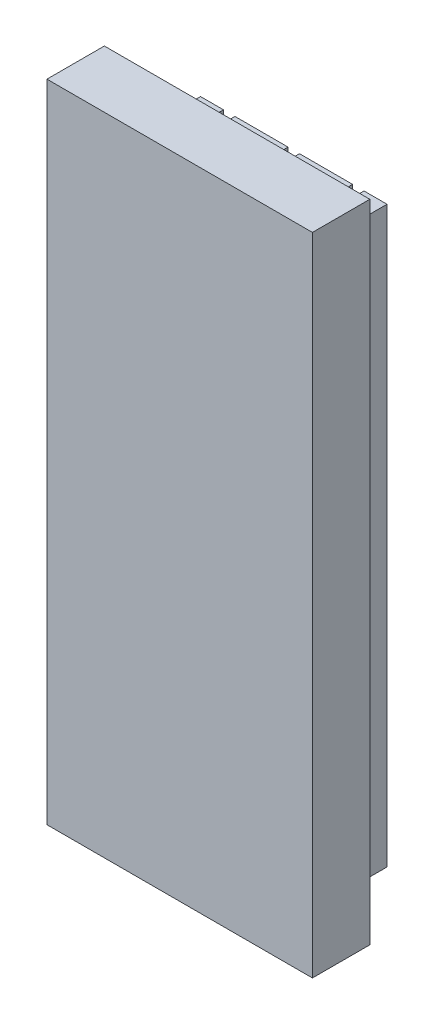
ISO-10303-21;
HEADER;
FILE_DESCRIPTION(('STEP AP214'),'2;1');
FILE_NAME('part.step','',(''),(''),'','','');
FILE_SCHEMA(('AUTOMOTIVE_DESIGN { 1 0 10303 214 1 1 1 1 }'));
ENDSEC;
DATA;
#1=APPLICATION_CONTEXT('core data for automotive mechanical design processes');
#2=APPLICATION_PROTOCOL_DEFINITION('international standard','automotive_design',2000,#1);
#3=PRODUCT_CONTEXT('',#1,'mechanical');
#4=PRODUCT('Part','Part','',(#3));
#5=PRODUCT_RELATED_PRODUCT_CATEGORY('part','',(#4));
#6=PRODUCT_DEFINITION_FORMATION('','',#4);
#7=PRODUCT_DEFINITION_CONTEXT('part definition',#1,'design');
#8=PRODUCT_DEFINITION('design','',#6,#7);
#9=PRODUCT_DEFINITION_SHAPE('','',#8);
#10=(LENGTH_UNIT() NAMED_UNIT(*) SI_UNIT(.MILLI.,.METRE.));
#11=(NAMED_UNIT(*) PLANE_ANGLE_UNIT() SI_UNIT($,.RADIAN.));
#12=(NAMED_UNIT(*) SI_UNIT($,.STERADIAN.) SOLID_ANGLE_UNIT());
#13=UNCERTAINTY_MEASURE_WITH_UNIT(LENGTH_MEASURE(1.E-05),#10,'distance_accuracy_value','');
#14=(GEOMETRIC_REPRESENTATION_CONTEXT(3) GLOBAL_UNCERTAINTY_ASSIGNED_CONTEXT((#13)) GLOBAL_UNIT_ASSIGNED_CONTEXT((#10,
#11,#12)) REPRESENTATION_CONTEXT('',''));
#15=CARTESIAN_POINT('',(0.,0.,0.));
#16=DIRECTION('',(0.,0.,1.));
#17=DIRECTION('',(1.,0.,0.));
#18=AXIS2_PLACEMENT_3D('',#15,#16,#17);
#19=CARTESIAN_POINT('',(-260.,800.,0.));
#20=DIRECTION('',(1.,0.,0.));
#21=DIRECTION('',(0.,0.,-1.));
#22=AXIS2_PLACEMENT_3D('',#19,#20,#21);
#23=PLANE('',#22);
#24=DIRECTION('',(0.,-1.,0.));
#25=VECTOR('',#24,1.);
#26=CARTESIAN_POINT('',(-260.,800.,-34.));
#27=LINE('',#26,#25);
#28=CARTESIAN_POINT('',(-260.,800.,-34.));
#29=VERTEX_POINT('',#28);
#30=CARTESIAN_POINT('',(-260.,0.,-34.));
#31=VERTEX_POINT('',#30);
#32=EDGE_CURVE('E62',#29,#31,#27,.T.);
#33=ORIENTED_EDGE('',*,*,#32,.F.);
#34=DIRECTION('',(0.,0.,1.));
#35=VECTOR('',#34,1.);
#36=CARTESIAN_POINT('',(-260.,800.,0.));
#37=LINE('',#36,#35);
#38=CARTESIAN_POINT('',(-260.,800.,-90.));
#39=VERTEX_POINT('',#38);
#40=EDGE_CURVE('E307',#39,#29,#37,.T.);
#41=ORIENTED_EDGE('',*,*,#40,.F.);
#42=DIRECTION('',(0.,-1.,0.));
#43=VECTOR('',#42,1.);
#44=CARTESIAN_POINT('',(-260.,800.,-90.));
#45=LINE('',#44,#43);
#46=CARTESIAN_POINT('',(-260.,0.,-90.));
#47=VERTEX_POINT('',#46);
#48=EDGE_CURVE('E476',#39,#47,#45,.T.);
#49=ORIENTED_EDGE('',*,*,#48,.T.);
#50=DIRECTION('',(0.,0.,1.));
#51=VECTOR('',#50,1.);
#52=CARTESIAN_POINT('',(-260.,0.,0.));
#53=LINE('',#52,#51);
#54=EDGE_CURVE('E368',#47,#31,#53,.T.);
#55=ORIENTED_EDGE('',*,*,#54,.T.);
#56=EDGE_LOOP('',(#33,#41,#49,#55));
#57=FACE_BOUND('',#56,.T.);
#58=ADVANCED_FACE('F39',(#57),#23,.F.);
#59=CARTESIAN_POINT('',(0.,800.,0.));
#60=DIRECTION('',(1.,0.,0.));
#61=DIRECTION('',(0.,0.,-1.));
#62=AXIS2_PLACEMENT_3D('',#59,#60,#61);
#63=PLANE('',#62);
#64=DIRECTION('',(0.,0.,1.));
#65=VECTOR('',#64,1.);
#66=CARTESIAN_POINT('',(0.,800.,0.));
#67=LINE('',#66,#65);
#68=CARTESIAN_POINT('',(0.,800.,-90.));
#69=VERTEX_POINT('',#68);
#70=CARTESIAN_POINT('',(0.,800.,-34.));
#71=VERTEX_POINT('',#70);
#72=EDGE_CURVE('E311',#69,#71,#67,.T.);
#73=ORIENTED_EDGE('',*,*,#72,.T.);
#74=DIRECTION('',(0.,-1.,0.));
#75=VECTOR('',#74,1.);
#76=CARTESIAN_POINT('',(0.,800.,-34.));
#77=LINE('',#76,#75);
#78=CARTESIAN_POINT('',(0.,0.,-34.));
#79=VERTEX_POINT('',#78);
#80=EDGE_CURVE('E261',#71,#79,#77,.T.);
#81=ORIENTED_EDGE('',*,*,#80,.T.);
#82=DIRECTION('',(0.,0.,1.));
#83=VECTOR('',#82,1.);
#84=CARTESIAN_POINT('',(0.,0.,0.));
#85=LINE('',#84,#83);
#86=CARTESIAN_POINT('',(0.,0.,-90.));
#87=VERTEX_POINT('',#86);
#88=EDGE_CURVE('E372',#87,#79,#85,.T.);
#89=ORIENTED_EDGE('',*,*,#88,.F.);
#90=DIRECTION('',(0.,-1.,0.));
#91=VECTOR('',#90,1.);
#92=CARTESIAN_POINT('',(0.,800.,-90.));
#93=LINE('',#92,#91);
#94=EDGE_CURVE('E474',#69,#87,#93,.T.);
#95=ORIENTED_EDGE('',*,*,#94,.F.);
#96=EDGE_LOOP('',(#73,#81,#89,#95));
#97=FACE_BOUND('',#96,.T.);
#98=ADVANCED_FACE('F540',(#97),#63,.T.);
#99=CARTESIAN_POINT('',(0.,800.,0.));
#100=DIRECTION('',(0.,1.,0.));
#101=DIRECTION('',(0.,0.,1.));
#102=AXIS2_PLACEMENT_3D('',#99,#100,#101);
#103=PLANE('',#102);
#104=ORIENTED_EDGE('',*,*,#40,.T.);
#105=DIRECTION('',(1.,0.,0.));
#106=VECTOR('',#105,1.);
#107=CARTESIAN_POINT('',(0.,800.,-34.));
#108=LINE('',#107,#106);
#109=EDGE_CURVE('E54',#29,#71,#108,.T.);
#110=ORIENTED_EDGE('',*,*,#109,.T.);
#111=ORIENTED_EDGE('',*,*,#72,.F.);
#112=DIRECTION('',(1.,0.,0.));
#113=VECTOR('',#112,1.);
#114=CARTESIAN_POINT('',(0.,800.,-90.));
#115=LINE('',#114,#113);
#116=CARTESIAN_POINT('',(-32.,800.,-90.));
#117=VERTEX_POINT('',#116);
#118=EDGE_CURVE('E309',#117,#69,#115,.T.);
#119=ORIENTED_EDGE('',*,*,#118,.F.);
#120=DIRECTION('',(0.,0.,-1.));
#121=VECTOR('',#120,1.);
#122=CARTESIAN_POINT('',(-32.0000000000001,800.,0.));
#123=LINE('',#122,#121);
#124=CARTESIAN_POINT('',(-32.,800.,-81.));
#125=VERTEX_POINT('',#124);
#126=EDGE_CURVE('E313',#125,#117,#123,.T.);
#127=ORIENTED_EDGE('',*,*,#126,.F.);
#128=DIRECTION('',(-1.,0.,0.));
#129=VECTOR('',#128,1.);
#130=CARTESIAN_POINT('',(0.,800.,-81.));
#131=LINE('',#130,#129);
#132=CARTESIAN_POINT('',(-24.,800.,-81.));
#133=VERTEX_POINT('',#132);
#134=EDGE_CURVE('E316',#133,#125,#131,.T.);
#135=ORIENTED_EDGE('',*,*,#134,.F.);
#136=DIRECTION('',(0.,0.,-1.));
#137=VECTOR('',#136,1.);
#138=CARTESIAN_POINT('',(-24.0000000000004,800.,-1.11022302462518E-13));
#139=LINE('',#138,#137);
#140=CARTESIAN_POINT('',(-24.0000000000001,800.,-72.));
#141=VERTEX_POINT('',#140);
#142=EDGE_CURVE('E319',#141,#133,#139,.T.);
#143=ORIENTED_EDGE('',*,*,#142,.F.);
#144=DIRECTION('',(1.,0.,0.));
#145=VECTOR('',#144,1.);
#146=CARTESIAN_POINT('',(0.,800.,-72.));
#147=LINE('',#146,#145);
#148=CARTESIAN_POINT('',(-56.0000000000001,800.,-72.));
#149=VERTEX_POINT('',#148);
#150=EDGE_CURVE('E322',#149,#141,#147,.T.);
#151=ORIENTED_EDGE('',*,*,#150,.F.);
#152=DIRECTION('',(0.,0.,1.));
#153=VECTOR('',#152,1.);
#154=CARTESIAN_POINT('',(-56.0000000000001,800.,0.));
#155=LINE('',#154,#153);
#156=CARTESIAN_POINT('',(-56.0000000000001,800.,-81.));
#157=VERTEX_POINT('',#156);
#158=EDGE_CURVE('E325',#157,#149,#155,.T.);
#159=ORIENTED_EDGE('',*,*,#158,.F.);
#160=DIRECTION('',(-1.,0.,0.));
#161=VECTOR('',#160,1.);
#162=CARTESIAN_POINT('',(0.,800.,-81.));
#163=LINE('',#162,#161);
#164=CARTESIAN_POINT('',(-48.,800.,-81.));
#165=VERTEX_POINT('',#164);
#166=EDGE_CURVE('E328',#165,#157,#163,.T.);
#167=ORIENTED_EDGE('',*,*,#166,.F.);
#168=DIRECTION('',(0.,0.,1.));
#169=VECTOR('',#168,1.);
#170=CARTESIAN_POINT('',(-48.,800.,0.));
#171=LINE('',#170,#169);
#172=CARTESIAN_POINT('',(-48.,800.,-90.));
#173=VERTEX_POINT('',#172);
#174=EDGE_CURVE('E331',#173,#165,#171,.T.);
#175=ORIENTED_EDGE('',*,*,#174,.F.);
#176=CARTESIAN_POINT('',(-122.,800.,-90.));
#177=VERTEX_POINT('',#176);
#178=EDGE_CURVE('E334',#177,#173,#115,.T.);
#179=ORIENTED_EDGE('',*,*,#178,.F.);
#180=DIRECTION('',(0.,0.,1.));
#181=VECTOR('',#180,1.);
#182=CARTESIAN_POINT('',(-122.,800.,1.8812112361704E-13));
#183=LINE('',#182,#181);
#184=CARTESIAN_POINT('',(-122.,800.,-81.));
#185=VERTEX_POINT('',#184);
#186=EDGE_CURVE('E335',#177,#185,#183,.T.);
#187=ORIENTED_EDGE('',*,*,#186,.T.);
#188=DIRECTION('',(1.,0.,0.));
#189=VECTOR('',#188,1.);
#190=CARTESIAN_POINT('',(-1.40512601554122E-13,800.,-81.0000000000002));
#191=LINE('',#190,#189);
#192=CARTESIAN_POINT('',(-114.,800.,-81.));
#193=VERTEX_POINT('',#192);
#194=EDGE_CURVE('E337',#185,#193,#191,.T.);
#195=ORIENTED_EDGE('',*,*,#194,.T.);
#196=DIRECTION('',(0.,0.,1.));
#197=VECTOR('',#196,1.);
#198=CARTESIAN_POINT('',(-114.,800.,1.75785312232316E-13));
#199=LINE('',#198,#197);
#200=CARTESIAN_POINT('',(-114.,800.,-72.));
#201=VERTEX_POINT('',#200);
#202=EDGE_CURVE('E339',#193,#201,#199,.T.);
#203=ORIENTED_EDGE('',*,*,#202,.T.);
#204=DIRECTION('',(-1.,0.,0.));
#205=VECTOR('',#204,1.);
#206=CARTESIAN_POINT('',(0.,800.,-72.));
#207=LINE('',#206,#205);
#208=CARTESIAN_POINT('',(-146.,800.,-72.));
#209=VERTEX_POINT('',#208);
#210=EDGE_CURVE('E341',#201,#209,#207,.T.);
#211=ORIENTED_EDGE('',*,*,#210,.T.);
#212=DIRECTION('',(0.,0.,-1.));
#213=VECTOR('',#212,1.);
#214=CARTESIAN_POINT('',(-146.,800.,0.));
#215=LINE('',#214,#213);
#216=CARTESIAN_POINT('',(-146.,800.,-81.));
#217=VERTEX_POINT('',#216);
#218=EDGE_CURVE('E343',#209,#217,#215,.T.);
#219=ORIENTED_EDGE('',*,*,#218,.T.);
#220=DIRECTION('',(1.,0.,0.));
#221=VECTOR('',#220,1.);
#222=CARTESIAN_POINT('',(0.,800.,-81.));
#223=LINE('',#222,#221);
#224=CARTESIAN_POINT('',(-138.,800.,-81.));
#225=VERTEX_POINT('',#224);
#226=EDGE_CURVE('E345',#217,#225,#223,.T.);
#227=ORIENTED_EDGE('',*,*,#226,.T.);
#228=DIRECTION('',(0.,0.,-1.));
#229=VECTOR('',#228,1.);
#230=CARTESIAN_POINT('',(-138.,800.,0.));
#231=LINE('',#230,#229);
#232=CARTESIAN_POINT('',(-138.,800.,-90.));
#233=VERTEX_POINT('',#232);
#234=EDGE_CURVE('E347',#225,#233,#231,.T.);
#235=ORIENTED_EDGE('',*,*,#234,.T.);
#236=CARTESIAN_POINT('',(-212.,800.,-90.));
#237=VERTEX_POINT('',#236);
#238=EDGE_CURVE('E308',#237,#233,#115,.T.);
#239=ORIENTED_EDGE('',*,*,#238,.F.);
#240=DIRECTION('',(0.,0.,1.));
#241=VECTOR('',#240,1.);
#242=CARTESIAN_POINT('',(-212.,800.,0.));
#243=LINE('',#242,#241);
#244=CARTESIAN_POINT('',(-212.,800.,-81.));
#245=VERTEX_POINT('',#244);
#246=EDGE_CURVE('E349',#237,#245,#243,.T.);
#247=ORIENTED_EDGE('',*,*,#246,.T.);
#248=DIRECTION('',(1.,0.,0.));
#249=VECTOR('',#248,1.);
#250=CARTESIAN_POINT('',(0.,800.,-81.));
#251=LINE('',#250,#249);
#252=CARTESIAN_POINT('',(-204.,800.,-81.));
#253=VERTEX_POINT('',#252);
#254=EDGE_CURVE('E351',#245,#253,#251,.T.);
#255=ORIENTED_EDGE('',*,*,#254,.T.);
#256=DIRECTION('',(0.,0.,1.));
#257=VECTOR('',#256,1.);
#258=CARTESIAN_POINT('',(-204.,800.,0.));
#259=LINE('',#258,#257);
#260=CARTESIAN_POINT('',(-204.,800.,-72.0000000000001));
#261=VERTEX_POINT('',#260);
#262=EDGE_CURVE('E353',#253,#261,#259,.T.);
#263=ORIENTED_EDGE('',*,*,#262,.T.);
#264=DIRECTION('',(-1.,0.,0.));
#265=VECTOR('',#264,1.);
#266=CARTESIAN_POINT('',(0.,800.,-72.0000000000001));
#267=LINE('',#266,#265);
#268=CARTESIAN_POINT('',(-236.,800.,-72.0000000000001));
#269=VERTEX_POINT('',#268);
#270=EDGE_CURVE('E355',#261,#269,#267,.T.);
#271=ORIENTED_EDGE('',*,*,#270,.T.);
#272=DIRECTION('',(0.,0.,-1.));
#273=VECTOR('',#272,1.);
#274=CARTESIAN_POINT('',(-236.,800.,7.27812871698714E-13));
#275=LINE('',#274,#273);
#276=CARTESIAN_POINT('',(-236.,800.,-81.));
#277=VERTEX_POINT('',#276);
#278=EDGE_CURVE('E357',#269,#277,#275,.T.);
#279=ORIENTED_EDGE('',*,*,#278,.T.);
#280=DIRECTION('',(1.,0.,0.));
#281=VECTOR('',#280,1.);
#282=CARTESIAN_POINT('',(0.,800.,-81.));
#283=LINE('',#282,#281);
#284=CARTESIAN_POINT('',(-228.,800.,-81.));
#285=VERTEX_POINT('',#284);
#286=EDGE_CURVE('E298',#277,#285,#283,.T.);
#287=ORIENTED_EDGE('',*,*,#286,.T.);
#288=DIRECTION('',(0.,0.,-1.));
#289=VECTOR('',#288,1.);
#290=CARTESIAN_POINT('',(-228.,800.,0.));
#291=LINE('',#290,#289);
#292=CARTESIAN_POINT('',(-228.,800.,-90.));
#293=VERTEX_POINT('',#292);
#294=EDGE_CURVE('E301',#285,#293,#291,.T.);
#295=ORIENTED_EDGE('',*,*,#294,.T.);
#296=EDGE_CURVE('E304',#39,#293,#115,.T.);
#297=ORIENTED_EDGE('',*,*,#296,.F.);
#298=EDGE_LOOP('',(#104,#110,#111,#119,#127,#135,#143,#151,#159,#167,#175,#179,#187,#195,#203,
#211,#219,#227,#235,#239,#247,#255,#263,#271,#279,#287,#295,#297));
#299=FACE_BOUND('',#298,.T.);
#300=ADVANCED_FACE('F497',(#299),#103,.T.);
#301=CARTESIAN_POINT('',(0.,0.,0.));
#302=DIRECTION('',(0.,1.,0.));
#303=DIRECTION('',(0.,0.,1.));
#304=AXIS2_PLACEMENT_3D('',#301,#302,#303);
#305=PLANE('',#304);
#306=DIRECTION('',(1.,0.,0.));
#307=VECTOR('',#306,1.);
#308=CARTESIAN_POINT('',(0.,0.,-34.));
#309=LINE('',#308,#307);
#310=EDGE_CURVE('E11',#31,#79,#309,.T.);
#311=ORIENTED_EDGE('',*,*,#310,.F.);
#312=ORIENTED_EDGE('',*,*,#54,.F.);
#313=DIRECTION('',(1.,0.,0.));
#314=VECTOR('',#313,1.);
#315=CARTESIAN_POINT('',(0.,0.,-90.));
#316=LINE('',#315,#314);
#317=CARTESIAN_POINT('',(-228.,0.,-90.));
#318=VERTEX_POINT('',#317);
#319=EDGE_CURVE('E365',#47,#318,#316,.T.);
#320=ORIENTED_EDGE('',*,*,#319,.T.);
#321=DIRECTION('',(0.,0.,-1.));
#322=VECTOR('',#321,1.);
#323=CARTESIAN_POINT('',(-228.,0.,0.));
#324=LINE('',#323,#322);
#325=CARTESIAN_POINT('',(-228.,0.,-81.));
#326=VERTEX_POINT('',#325);
#327=EDGE_CURVE('E362',#326,#318,#324,.T.);
#328=ORIENTED_EDGE('',*,*,#327,.F.);
#329=DIRECTION('',(1.,0.,0.));
#330=VECTOR('',#329,1.);
#331=CARTESIAN_POINT('',(0.,0.,-81.));
#332=LINE('',#331,#330);
#333=CARTESIAN_POINT('',(-236.,0.,-81.));
#334=VERTEX_POINT('',#333);
#335=EDGE_CURVE('E297',#334,#326,#332,.T.);
#336=ORIENTED_EDGE('',*,*,#335,.F.);
#337=DIRECTION('',(0.,0.,-1.));
#338=VECTOR('',#337,1.);
#339=CARTESIAN_POINT('',(-236.,0.,7.27812871698714E-13));
#340=LINE('',#339,#338);
#341=CARTESIAN_POINT('',(-236.,0.,-72.0000000000001));
#342=VERTEX_POINT('',#341);
#343=EDGE_CURVE('E302',#342,#334,#340,.T.);
#344=ORIENTED_EDGE('',*,*,#343,.F.);
#345=DIRECTION('',(-1.,0.,0.));
#346=VECTOR('',#345,1.);
#347=CARTESIAN_POINT('',(0.,0.,-72.0000000000001));
#348=LINE('',#347,#346);
#349=CARTESIAN_POINT('',(-204.,0.,-72.0000000000001));
#350=VERTEX_POINT('',#349);
#351=EDGE_CURVE('E417',#350,#342,#348,.T.);
#352=ORIENTED_EDGE('',*,*,#351,.F.);
#353=DIRECTION('',(0.,0.,1.));
#354=VECTOR('',#353,1.);
#355=CARTESIAN_POINT('',(-204.,0.,0.));
#356=LINE('',#355,#354);
#357=CARTESIAN_POINT('',(-204.,0.,-81.));
#358=VERTEX_POINT('',#357);
#359=EDGE_CURVE('E415',#358,#350,#356,.T.);
#360=ORIENTED_EDGE('',*,*,#359,.F.);
#361=DIRECTION('',(1.,0.,0.));
#362=VECTOR('',#361,1.);
#363=CARTESIAN_POINT('',(0.,0.,-81.));
#364=LINE('',#363,#362);
#365=CARTESIAN_POINT('',(-212.,0.,-81.));
#366=VERTEX_POINT('',#365);
#367=EDGE_CURVE('E413',#366,#358,#364,.T.);
#368=ORIENTED_EDGE('',*,*,#367,.F.);
#369=DIRECTION('',(0.,0.,1.));
#370=VECTOR('',#369,1.);
#371=CARTESIAN_POINT('',(-212.,0.,0.));
#372=LINE('',#371,#370);
#373=CARTESIAN_POINT('',(-212.,0.,-90.));
#374=VERTEX_POINT('',#373);
#375=EDGE_CURVE('E411',#374,#366,#372,.T.);
#376=ORIENTED_EDGE('',*,*,#375,.F.);
#377=CARTESIAN_POINT('',(-138.,0.,-90.));
#378=VERTEX_POINT('',#377);
#379=EDGE_CURVE('E369',#374,#378,#316,.T.);
#380=ORIENTED_EDGE('',*,*,#379,.T.);
#381=DIRECTION('',(0.,0.,-1.));
#382=VECTOR('',#381,1.);
#383=CARTESIAN_POINT('',(-138.,0.,0.));
#384=LINE('',#383,#382);
#385=CARTESIAN_POINT('',(-138.,0.,-81.));
#386=VERTEX_POINT('',#385);
#387=EDGE_CURVE('E408',#386,#378,#384,.T.);
#388=ORIENTED_EDGE('',*,*,#387,.F.);
#389=DIRECTION('',(1.,0.,0.));
#390=VECTOR('',#389,1.);
#391=CARTESIAN_POINT('',(0.,0.,-81.));
#392=LINE('',#391,#390);
#393=CARTESIAN_POINT('',(-146.,0.,-81.));
#394=VERTEX_POINT('',#393);
#395=EDGE_CURVE('E406',#394,#386,#392,.T.);
#396=ORIENTED_EDGE('',*,*,#395,.F.);
#397=DIRECTION('',(0.,0.,-1.));
#398=VECTOR('',#397,1.);
#399=CARTESIAN_POINT('',(-146.,0.,0.));
#400=LINE('',#399,#398);
#401=CARTESIAN_POINT('',(-146.,0.,-72.));
#402=VERTEX_POINT('',#401);
#403=EDGE_CURVE('E404',#402,#394,#400,.T.);
#404=ORIENTED_EDGE('',*,*,#403,.F.);
#405=DIRECTION('',(-1.,0.,0.));
#406=VECTOR('',#405,1.);
#407=CARTESIAN_POINT('',(0.,0.,-72.));
#408=LINE('',#407,#406);
#409=CARTESIAN_POINT('',(-114.,0.,-72.));
#410=VERTEX_POINT('',#409);
#411=EDGE_CURVE('E402',#410,#402,#408,.T.);
#412=ORIENTED_EDGE('',*,*,#411,.F.);
#413=DIRECTION('',(0.,0.,1.));
#414=VECTOR('',#413,1.);
#415=CARTESIAN_POINT('',(-114.,0.,1.75785312232316E-13));
#416=LINE('',#415,#414);
#417=CARTESIAN_POINT('',(-114.,0.,-81.));
#418=VERTEX_POINT('',#417);
#419=EDGE_CURVE('E400',#418,#410,#416,.T.);
#420=ORIENTED_EDGE('',*,*,#419,.F.);
#421=DIRECTION('',(1.,0.,0.));
#422=VECTOR('',#421,1.);
#423=CARTESIAN_POINT('',(-1.40512601554122E-13,0.,-81.0000000000002));
#424=LINE('',#423,#422);
#425=CARTESIAN_POINT('',(-122.,0.,-81.));
#426=VERTEX_POINT('',#425);
#427=EDGE_CURVE('E398',#426,#418,#424,.T.);
#428=ORIENTED_EDGE('',*,*,#427,.F.);
#429=DIRECTION('',(0.,0.,1.));
#430=VECTOR('',#429,1.);
#431=CARTESIAN_POINT('',(-122.,0.,1.8812112361704E-13));
#432=LINE('',#431,#430);
#433=CARTESIAN_POINT('',(-122.,0.,-90.));
#434=VERTEX_POINT('',#433);
#435=EDGE_CURVE('E396',#434,#426,#432,.T.);
#436=ORIENTED_EDGE('',*,*,#435,.F.);
#437=CARTESIAN_POINT('',(-48.,0.,-90.));
#438=VERTEX_POINT('',#437);
#439=EDGE_CURVE('E395',#434,#438,#316,.T.);
#440=ORIENTED_EDGE('',*,*,#439,.T.);
#441=DIRECTION('',(0.,0.,1.));
#442=VECTOR('',#441,1.);
#443=CARTESIAN_POINT('',(-48.,0.,0.));
#444=LINE('',#443,#442);
#445=CARTESIAN_POINT('',(-48.,0.,-81.));
#446=VERTEX_POINT('',#445);
#447=EDGE_CURVE('E392',#438,#446,#444,.T.);
#448=ORIENTED_EDGE('',*,*,#447,.T.);
#449=DIRECTION('',(-1.,0.,0.));
#450=VECTOR('',#449,1.);
#451=CARTESIAN_POINT('',(0.,0.,-81.));
#452=LINE('',#451,#450);
#453=CARTESIAN_POINT('',(-56.0000000000001,0.,-81.));
#454=VERTEX_POINT('',#453);
#455=EDGE_CURVE('E389',#446,#454,#452,.T.);
#456=ORIENTED_EDGE('',*,*,#455,.T.);
#457=DIRECTION('',(0.,0.,1.));
#458=VECTOR('',#457,1.);
#459=CARTESIAN_POINT('',(-56.0000000000001,0.,0.));
#460=LINE('',#459,#458);
#461=CARTESIAN_POINT('',(-56.0000000000001,0.,-72.));
#462=VERTEX_POINT('',#461);
#463=EDGE_CURVE('E386',#454,#462,#460,.T.);
#464=ORIENTED_EDGE('',*,*,#463,.T.);
#465=DIRECTION('',(1.,0.,0.));
#466=VECTOR('',#465,1.);
#467=CARTESIAN_POINT('',(0.,0.,-72.));
#468=LINE('',#467,#466);
#469=CARTESIAN_POINT('',(-24.0000000000001,0.,-72.));
#470=VERTEX_POINT('',#469);
#471=EDGE_CURVE('E383',#462,#470,#468,.T.);
#472=ORIENTED_EDGE('',*,*,#471,.T.);
#473=DIRECTION('',(0.,0.,-1.));
#474=VECTOR('',#473,1.);
#475=CARTESIAN_POINT('',(-24.0000000000004,0.,-1.11022302462518E-13));
#476=LINE('',#475,#474);
#477=CARTESIAN_POINT('',(-24.,0.,-81.));
#478=VERTEX_POINT('',#477);
#479=EDGE_CURVE('E380',#470,#478,#476,.T.);
#480=ORIENTED_EDGE('',*,*,#479,.T.);
#481=DIRECTION('',(-1.,0.,0.));
#482=VECTOR('',#481,1.);
#483=CARTESIAN_POINT('',(0.,0.,-81.));
#484=LINE('',#483,#482);
#485=CARTESIAN_POINT('',(-32.,0.,-81.));
#486=VERTEX_POINT('',#485);
#487=EDGE_CURVE('E377',#478,#486,#484,.T.);
#488=ORIENTED_EDGE('',*,*,#487,.T.);
#489=DIRECTION('',(0.,0.,-1.));
#490=VECTOR('',#489,1.);
#491=CARTESIAN_POINT('',(-32.0000000000001,0.,0.));
#492=LINE('',#491,#490);
#493=CARTESIAN_POINT('',(-32.,0.,-90.));
#494=VERTEX_POINT('',#493);
#495=EDGE_CURVE('E374',#486,#494,#492,.T.);
#496=ORIENTED_EDGE('',*,*,#495,.T.);
#497=EDGE_CURVE('E370',#494,#87,#316,.T.);
#498=ORIENTED_EDGE('',*,*,#497,.T.);
#499=ORIENTED_EDGE('',*,*,#88,.T.);
#500=EDGE_LOOP('',(#311,#312,#320,#328,#336,#344,#352,#360,#368,#376,#380,#388,#396,#404,#412,
#420,#428,#436,#440,#448,#456,#464,#472,#480,#488,#496,#498,#499));
#501=FACE_BOUND('',#500,.T.);
#502=ADVANCED_FACE('F490',(#501),#305,.F.);
#503=CARTESIAN_POINT('',(0.,800.,-81.));
#504=DIRECTION('',(0.,0.,-1.));
#505=DIRECTION('',(-1.,0.,0.));
#506=AXIS2_PLACEMENT_3D('',#503,#504,#505);
#507=PLANE('',#506);
#508=ORIENTED_EDGE('',*,*,#335,.T.);
#509=DIRECTION('',(0.,-1.,0.));
#510=VECTOR('',#509,1.);
#511=CARTESIAN_POINT('',(-228.,800.,-81.));
#512=LINE('',#511,#510);
#513=EDGE_CURVE('E47',#285,#326,#512,.T.);
#514=ORIENTED_EDGE('',*,*,#513,.F.);
#515=ORIENTED_EDGE('',*,*,#286,.F.);
#516=DIRECTION('',(0.,-1.,0.));
#517=VECTOR('',#516,1.);
#518=CARTESIAN_POINT('',(-236.,800.,-81.));
#519=LINE('',#518,#517);
#520=EDGE_CURVE('E359',#277,#334,#519,.T.);
#521=ORIENTED_EDGE('',*,*,#520,.T.);
#522=EDGE_LOOP('',(#508,#514,#515,#521));
#523=FACE_BOUND('',#522,.T.);
#524=ADVANCED_FACE('F41',(#523),#507,.F.);
#525=CARTESIAN_POINT('',(-228.,800.,0.));
#526=DIRECTION('',(-1.,0.,0.));
#527=DIRECTION('',(0.,0.,1.));
#528=AXIS2_PLACEMENT_3D('',#525,#526,#527);
#529=PLANE('',#528);
#530=ORIENTED_EDGE('',*,*,#327,.T.);
#531=DIRECTION('',(0.,-1.,0.));
#532=VECTOR('',#531,1.);
#533=CARTESIAN_POINT('',(-228.,800.,-90.));
#534=LINE('',#533,#532);
#535=EDGE_CURVE('E478',#293,#318,#534,.T.);
#536=ORIENTED_EDGE('',*,*,#535,.F.);
#537=ORIENTED_EDGE('',*,*,#294,.F.);
#538=ORIENTED_EDGE('',*,*,#513,.T.);
#539=EDGE_LOOP('',(#530,#536,#537,#538));
#540=FACE_BOUND('',#539,.T.);
#541=ADVANCED_FACE('F482',(#540),#529,.F.);
#542=CARTESIAN_POINT('',(0.,800.,-90.));
#543=DIRECTION('',(0.,0.,-1.));
#544=DIRECTION('',(-1.,0.,0.));
#545=AXIS2_PLACEMENT_3D('',#542,#543,#544);
#546=PLANE('',#545);
#547=ORIENTED_EDGE('',*,*,#319,.F.);
#548=ORIENTED_EDGE('',*,*,#48,.F.);
#549=ORIENTED_EDGE('',*,*,#296,.T.);
#550=ORIENTED_EDGE('',*,*,#535,.T.);
#551=EDGE_LOOP('',(#547,#548,#549,#550));
#552=FACE_BOUND('',#551,.T.);
#553=ADVANCED_FACE('F495',(#552),#546,.T.);
#554=ORIENTED_EDGE('',*,*,#497,.F.);
#555=DIRECTION('',(0.,-1.,0.));
#556=VECTOR('',#555,1.);
#557=CARTESIAN_POINT('',(-32.,800.,-90.));
#558=LINE('',#557,#556);
#559=EDGE_CURVE('E472',#117,#494,#558,.T.);
#560=ORIENTED_EDGE('',*,*,#559,.F.);
#561=ORIENTED_EDGE('',*,*,#118,.T.);
#562=ORIENTED_EDGE('',*,*,#94,.T.);
#563=EDGE_LOOP('',(#554,#560,#561,#562));
#564=FACE_BOUND('',#563,.T.);
#565=ADVANCED_FACE('F536',(#564),#546,.T.);
#566=CARTESIAN_POINT('',(-32.0000000000001,800.,0.));
#567=DIRECTION('',(-1.,0.,0.));
#568=DIRECTION('',(0.,0.,1.));
#569=AXIS2_PLACEMENT_3D('',#566,#567,#568);
#570=PLANE('',#569);
#571=ORIENTED_EDGE('',*,*,#495,.F.);
#572=DIRECTION('',(0.,-1.,0.));
#573=VECTOR('',#572,1.);
#574=CARTESIAN_POINT('',(-32.,800.,-81.));
#575=LINE('',#574,#573);
#576=EDGE_CURVE('E470',#125,#486,#575,.T.);
#577=ORIENTED_EDGE('',*,*,#576,.F.);
#578=ORIENTED_EDGE('',*,*,#126,.T.);
#579=ORIENTED_EDGE('',*,*,#559,.T.);
#580=EDGE_LOOP('',(#571,#577,#578,#579));
#581=FACE_BOUND('',#580,.T.);
#582=ADVANCED_FACE('F629',(#581),#570,.T.);
#583=CARTESIAN_POINT('',(0.,800.,-81.));
#584=DIRECTION('',(0.,0.,1.));
#585=DIRECTION('',(1.,0.,0.));
#586=AXIS2_PLACEMENT_3D('',#583,#584,#585);
#587=PLANE('',#586);
#588=ORIENTED_EDGE('',*,*,#487,.F.);
#589=DIRECTION('',(0.,-1.,0.));
#590=VECTOR('',#589,1.);
#591=CARTESIAN_POINT('',(-24.,800.,-81.));
#592=LINE('',#591,#590);
#593=EDGE_CURVE('E468',#133,#478,#592,.T.);
#594=ORIENTED_EDGE('',*,*,#593,.F.);
#595=ORIENTED_EDGE('',*,*,#134,.T.);
#596=ORIENTED_EDGE('',*,*,#576,.T.);
#597=EDGE_LOOP('',(#588,#594,#595,#596));
#598=FACE_BOUND('',#597,.T.);
#599=ADVANCED_FACE('F626',(#598),#587,.T.);
#600=CARTESIAN_POINT('',(-24.0000000000004,800.,-1.11022302462518E-13));
#601=DIRECTION('',(-1.,0.,0.));
#602=DIRECTION('',(0.,0.,1.));
#603=AXIS2_PLACEMENT_3D('',#600,#601,#602);
#604=PLANE('',#603);
#605=ORIENTED_EDGE('',*,*,#479,.F.);
#606=DIRECTION('',(0.,-1.,0.));
#607=VECTOR('',#606,1.);
#608=CARTESIAN_POINT('',(-24.0000000000001,800.,-72.));
#609=LINE('',#608,#607);
#610=EDGE_CURVE('E466',#141,#470,#609,.T.);
#611=ORIENTED_EDGE('',*,*,#610,.F.);
#612=ORIENTED_EDGE('',*,*,#142,.T.);
#613=ORIENTED_EDGE('',*,*,#593,.T.);
#614=EDGE_LOOP('',(#605,#611,#612,#613));
#615=FACE_BOUND('',#614,.T.);
#616=ADVANCED_FACE('F622',(#615),#604,.T.);
#617=CARTESIAN_POINT('',(0.,800.,-72.));
#618=DIRECTION('',(0.,0.,-1.));
#619=DIRECTION('',(-1.,0.,0.));
#620=AXIS2_PLACEMENT_3D('',#617,#618,#619);
#621=PLANE('',#620);
#622=ORIENTED_EDGE('',*,*,#471,.F.);
#623=DIRECTION('',(0.,-1.,0.));
#624=VECTOR('',#623,1.);
#625=CARTESIAN_POINT('',(-56.0000000000001,800.,-72.));
#626=LINE('',#625,#624);
#627=EDGE_CURVE('E464',#149,#462,#626,.T.);
#628=ORIENTED_EDGE('',*,*,#627,.F.);
#629=ORIENTED_EDGE('',*,*,#150,.T.);
#630=ORIENTED_EDGE('',*,*,#610,.T.);
#631=EDGE_LOOP('',(#622,#628,#629,#630));
#632=FACE_BOUND('',#631,.T.);
#633=ADVANCED_FACE('F618',(#632),#621,.T.);
#634=CARTESIAN_POINT('',(-56.0000000000001,800.,0.));
#635=DIRECTION('',(1.,0.,0.));
#636=DIRECTION('',(0.,0.,-1.));
#637=AXIS2_PLACEMENT_3D('',#634,#635,#636);
#638=PLANE('',#637);
#639=ORIENTED_EDGE('',*,*,#463,.F.);
#640=DIRECTION('',(0.,-1.,0.));
#641=VECTOR('',#640,1.);
#642=CARTESIAN_POINT('',(-56.0000000000001,800.,-81.));
#643=LINE('',#642,#641);
#644=EDGE_CURVE('E462',#157,#454,#643,.T.);
#645=ORIENTED_EDGE('',*,*,#644,.F.);
#646=ORIENTED_EDGE('',*,*,#158,.T.);
#647=ORIENTED_EDGE('',*,*,#627,.T.);
#648=EDGE_LOOP('',(#639,#645,#646,#647));
#649=FACE_BOUND('',#648,.T.);
#650=ADVANCED_FACE('F614',(#649),#638,.T.);
#651=CARTESIAN_POINT('',(0.,800.,-81.));
#652=DIRECTION('',(0.,0.,1.));
#653=DIRECTION('',(1.,0.,0.));
#654=AXIS2_PLACEMENT_3D('',#651,#652,#653);
#655=PLANE('',#654);
#656=ORIENTED_EDGE('',*,*,#455,.F.);
#657=DIRECTION('',(0.,-1.,0.));
#658=VECTOR('',#657,1.);
#659=CARTESIAN_POINT('',(-48.,800.,-81.));
#660=LINE('',#659,#658);
#661=EDGE_CURVE('E460',#165,#446,#660,.T.);
#662=ORIENTED_EDGE('',*,*,#661,.F.);
#663=ORIENTED_EDGE('',*,*,#166,.T.);
#664=ORIENTED_EDGE('',*,*,#644,.T.);
#665=EDGE_LOOP('',(#656,#662,#663,#664));
#666=FACE_BOUND('',#665,.T.);
#667=ADVANCED_FACE('F610',(#666),#655,.T.);
#668=CARTESIAN_POINT('',(-48.,800.,0.));
#669=DIRECTION('',(1.,0.,0.));
#670=DIRECTION('',(0.,0.,-1.));
#671=AXIS2_PLACEMENT_3D('',#668,#669,#670);
#672=PLANE('',#671);
#673=ORIENTED_EDGE('',*,*,#447,.F.);
#674=DIRECTION('',(0.,-1.,0.));
#675=VECTOR('',#674,1.);
#676=CARTESIAN_POINT('',(-48.,800.,-90.));
#677=LINE('',#676,#675);
#678=EDGE_CURVE('E458',#173,#438,#677,.T.);
#679=ORIENTED_EDGE('',*,*,#678,.F.);
#680=ORIENTED_EDGE('',*,*,#174,.T.);
#681=ORIENTED_EDGE('',*,*,#661,.T.);
#682=EDGE_LOOP('',(#673,#679,#680,#681));
#683=FACE_BOUND('',#682,.T.);
#684=ADVANCED_FACE('F607',(#683),#672,.T.);
#685=ORIENTED_EDGE('',*,*,#439,.F.);
#686=DIRECTION('',(0.,-1.,0.));
#687=VECTOR('',#686,1.);
#688=CARTESIAN_POINT('',(-122.,800.,-90.));
#689=LINE('',#688,#687);
#690=EDGE_CURVE('E456',#177,#434,#689,.T.);
#691=ORIENTED_EDGE('',*,*,#690,.F.);
#692=ORIENTED_EDGE('',*,*,#178,.T.);
#693=ORIENTED_EDGE('',*,*,#678,.T.);
#694=EDGE_LOOP('',(#685,#691,#692,#693));
#695=FACE_BOUND('',#694,.T.);
#696=ADVANCED_FACE('F579',(#695),#546,.T.);
#697=CARTESIAN_POINT('',(-122.,800.,1.8812112361704E-13));
#698=DIRECTION('',(1.,0.,0.));
#699=DIRECTION('',(0.,0.,-1.));
#700=AXIS2_PLACEMENT_3D('',#697,#698,#699);
#701=PLANE('',#700);
#702=ORIENTED_EDGE('',*,*,#435,.T.);
#703=DIRECTION('',(0.,-1.,0.));
#704=VECTOR('',#703,1.);
#705=CARTESIAN_POINT('',(-122.,800.,-81.));
#706=LINE('',#705,#704);
#707=EDGE_CURVE('E453',#185,#426,#706,.T.);
#708=ORIENTED_EDGE('',*,*,#707,.F.);
#709=ORIENTED_EDGE('',*,*,#186,.F.);
#710=ORIENTED_EDGE('',*,*,#690,.T.);
#711=EDGE_LOOP('',(#702,#708,#709,#710));
#712=FACE_BOUND('',#711,.T.);
#713=ADVANCED_FACE('F602',(#712),#701,.F.);
#714=CARTESIAN_POINT('',(-1.40512601554122E-13,800.,-81.0000000000002));
#715=DIRECTION('',(0.,0.,-1.));
#716=DIRECTION('',(-1.,0.,0.));
#717=AXIS2_PLACEMENT_3D('',#714,#715,#716);
#718=PLANE('',#717);
#719=ORIENTED_EDGE('',*,*,#427,.T.);
#720=DIRECTION('',(0.,-1.,0.));
#721=VECTOR('',#720,1.);
#722=CARTESIAN_POINT('',(-114.,800.,-81.));
#723=LINE('',#722,#721);
#724=EDGE_CURVE('E450',#193,#418,#723,.T.);
#725=ORIENTED_EDGE('',*,*,#724,.F.);
#726=ORIENTED_EDGE('',*,*,#194,.F.);
#727=ORIENTED_EDGE('',*,*,#707,.T.);
#728=EDGE_LOOP('',(#719,#725,#726,#727));
#729=FACE_BOUND('',#728,.T.);
#730=ADVANCED_FACE('F598',(#729),#718,.F.);
#731=CARTESIAN_POINT('',(-114.,800.,1.75785312232316E-13));
#732=DIRECTION('',(1.,0.,0.));
#733=DIRECTION('',(0.,0.,-1.));
#734=AXIS2_PLACEMENT_3D('',#731,#732,#733);
#735=PLANE('',#734);
#736=ORIENTED_EDGE('',*,*,#419,.T.);
#737=DIRECTION('',(0.,-1.,0.));
#738=VECTOR('',#737,1.);
#739=CARTESIAN_POINT('',(-114.,800.,-72.));
#740=LINE('',#739,#738);
#741=EDGE_CURVE('E447',#201,#410,#740,.T.);
#742=ORIENTED_EDGE('',*,*,#741,.F.);
#743=ORIENTED_EDGE('',*,*,#202,.F.);
#744=ORIENTED_EDGE('',*,*,#724,.T.);
#745=EDGE_LOOP('',(#736,#742,#743,#744));
#746=FACE_BOUND('',#745,.T.);
#747=ADVANCED_FACE('F594',(#746),#735,.F.);
#748=CARTESIAN_POINT('',(0.,800.,-72.));
#749=DIRECTION('',(0.,0.,1.));
#750=DIRECTION('',(1.,0.,0.));
#751=AXIS2_PLACEMENT_3D('',#748,#749,#750);
#752=PLANE('',#751);
#753=ORIENTED_EDGE('',*,*,#411,.T.);
#754=DIRECTION('',(0.,-1.,0.));
#755=VECTOR('',#754,1.);
#756=CARTESIAN_POINT('',(-146.,800.,-72.));
#757=LINE('',#756,#755);
#758=EDGE_CURVE('E444',#209,#402,#757,.T.);
#759=ORIENTED_EDGE('',*,*,#758,.F.);
#760=ORIENTED_EDGE('',*,*,#210,.F.);
#761=ORIENTED_EDGE('',*,*,#741,.T.);
#762=EDGE_LOOP('',(#753,#759,#760,#761));
#763=FACE_BOUND('',#762,.T.);
#764=ADVANCED_FACE('F590',(#763),#752,.F.);
#765=CARTESIAN_POINT('',(-146.,800.,0.));
#766=DIRECTION('',(-1.,0.,0.));
#767=DIRECTION('',(0.,0.,1.));
#768=AXIS2_PLACEMENT_3D('',#765,#766,#767);
#769=PLANE('',#768);
#770=ORIENTED_EDGE('',*,*,#403,.T.);
#771=DIRECTION('',(0.,-1.,0.));
#772=VECTOR('',#771,1.);
#773=CARTESIAN_POINT('',(-146.,800.,-81.));
#774=LINE('',#773,#772);
#775=EDGE_CURVE('E441',#217,#394,#774,.T.);
#776=ORIENTED_EDGE('',*,*,#775,.F.);
#777=ORIENTED_EDGE('',*,*,#218,.F.);
#778=ORIENTED_EDGE('',*,*,#758,.T.);
#779=EDGE_LOOP('',(#770,#776,#777,#778));
#780=FACE_BOUND('',#779,.T.);
#781=ADVANCED_FACE('F586',(#780),#769,.F.);
#782=CARTESIAN_POINT('',(0.,800.,-81.));
#783=DIRECTION('',(0.,0.,-1.));
#784=DIRECTION('',(-1.,0.,0.));
#785=AXIS2_PLACEMENT_3D('',#782,#783,#784);
#786=PLANE('',#785);
#787=ORIENTED_EDGE('',*,*,#395,.T.);
#788=DIRECTION('',(0.,-1.,0.));
#789=VECTOR('',#788,1.);
#790=CARTESIAN_POINT('',(-138.,800.,-81.));
#791=LINE('',#790,#789);
#792=EDGE_CURVE('E438',#225,#386,#791,.T.);
#793=ORIENTED_EDGE('',*,*,#792,.F.);
#794=ORIENTED_EDGE('',*,*,#226,.F.);
#795=ORIENTED_EDGE('',*,*,#775,.T.);
#796=EDGE_LOOP('',(#787,#793,#794,#795));
#797=FACE_BOUND('',#796,.T.);
#798=ADVANCED_FACE('F582',(#797),#786,.F.);
#799=CARTESIAN_POINT('',(-138.,800.,0.));
#800=DIRECTION('',(-1.,0.,0.));
#801=DIRECTION('',(0.,0.,1.));
#802=AXIS2_PLACEMENT_3D('',#799,#800,#801);
#803=PLANE('',#802);
#804=ORIENTED_EDGE('',*,*,#387,.T.);
#805=DIRECTION('',(0.,-1.,0.));
#806=VECTOR('',#805,1.);
#807=CARTESIAN_POINT('',(-138.,800.,-90.));
#808=LINE('',#807,#806);
#809=EDGE_CURVE('E436',#233,#378,#808,.T.);
#810=ORIENTED_EDGE('',*,*,#809,.F.);
#811=ORIENTED_EDGE('',*,*,#234,.F.);
#812=ORIENTED_EDGE('',*,*,#792,.T.);
#813=EDGE_LOOP('',(#804,#810,#811,#812));
#814=FACE_BOUND('',#813,.T.);
#815=ADVANCED_FACE('F578',(#814),#803,.F.);
#816=ORIENTED_EDGE('',*,*,#379,.F.);
#817=DIRECTION('',(0.,-1.,0.));
#818=VECTOR('',#817,1.);
#819=CARTESIAN_POINT('',(-212.,800.,-90.));
#820=LINE('',#819,#818);
#821=EDGE_CURVE('E434',#237,#374,#820,.T.);
#822=ORIENTED_EDGE('',*,*,#821,.F.);
#823=ORIENTED_EDGE('',*,*,#238,.T.);
#824=ORIENTED_EDGE('',*,*,#809,.T.);
#825=EDGE_LOOP('',(#816,#822,#823,#824));
#826=FACE_BOUND('',#825,.T.);
#827=ADVANCED_FACE('F525',(#826),#546,.T.);
#828=CARTESIAN_POINT('',(-212.,800.,0.));
#829=DIRECTION('',(1.,0.,0.));
#830=DIRECTION('',(0.,0.,-1.));
#831=AXIS2_PLACEMENT_3D('',#828,#829,#830);
#832=PLANE('',#831);
#833=ORIENTED_EDGE('',*,*,#375,.T.);
#834=DIRECTION('',(0.,-1.,0.));
#835=VECTOR('',#834,1.);
#836=CARTESIAN_POINT('',(-212.,800.,-81.));
#837=LINE('',#836,#835);
#838=EDGE_CURVE('E431',#245,#366,#837,.T.);
#839=ORIENTED_EDGE('',*,*,#838,.F.);
#840=ORIENTED_EDGE('',*,*,#246,.F.);
#841=ORIENTED_EDGE('',*,*,#821,.T.);
#842=EDGE_LOOP('',(#833,#839,#840,#841));
#843=FACE_BOUND('',#842,.T.);
#844=ADVANCED_FACE('F519',(#843),#832,.F.);
#845=CARTESIAN_POINT('',(0.,800.,-81.));
#846=DIRECTION('',(0.,0.,-1.));
#847=DIRECTION('',(-1.,0.,0.));
#848=AXIS2_PLACEMENT_3D('',#845,#846,#847);
#849=PLANE('',#848);
#850=ORIENTED_EDGE('',*,*,#367,.T.);
#851=DIRECTION('',(0.,-1.,0.));
#852=VECTOR('',#851,1.);
#853=CARTESIAN_POINT('',(-204.,800.,-81.));
#854=LINE('',#853,#852);
#855=EDGE_CURVE('E428',#253,#358,#854,.T.);
#856=ORIENTED_EDGE('',*,*,#855,.F.);
#857=ORIENTED_EDGE('',*,*,#254,.F.);
#858=ORIENTED_EDGE('',*,*,#838,.T.);
#859=EDGE_LOOP('',(#850,#856,#857,#858));
#860=FACE_BOUND('',#859,.T.);
#861=ADVANCED_FACE('F515',(#860),#849,.F.);
#862=CARTESIAN_POINT('',(-204.,800.,0.));
#863=DIRECTION('',(1.,0.,0.));
#864=DIRECTION('',(0.,0.,-1.));
#865=AXIS2_PLACEMENT_3D('',#862,#863,#864);
#866=PLANE('',#865);
#867=ORIENTED_EDGE('',*,*,#359,.T.);
#868=DIRECTION('',(0.,-1.,0.));
#869=VECTOR('',#868,1.);
#870=CARTESIAN_POINT('',(-204.,800.,-72.0000000000001));
#871=LINE('',#870,#869);
#872=EDGE_CURVE('E425',#261,#350,#871,.T.);
#873=ORIENTED_EDGE('',*,*,#872,.F.);
#874=ORIENTED_EDGE('',*,*,#262,.F.);
#875=ORIENTED_EDGE('',*,*,#855,.T.);
#876=EDGE_LOOP('',(#867,#873,#874,#875));
#877=FACE_BOUND('',#876,.T.);
#878=ADVANCED_FACE('F510',(#877),#866,.F.);
#879=CARTESIAN_POINT('',(0.,800.,-72.0000000000001));
#880=DIRECTION('',(0.,0.,1.));
#881=DIRECTION('',(1.,0.,0.));
#882=AXIS2_PLACEMENT_3D('',#879,#880,#881);
#883=PLANE('',#882);
#884=ORIENTED_EDGE('',*,*,#351,.T.);
#885=DIRECTION('',(0.,-1.,0.));
#886=VECTOR('',#885,1.);
#887=CARTESIAN_POINT('',(-236.,800.,-72.0000000000001));
#888=LINE('',#887,#886);
#889=EDGE_CURVE('E422',#269,#342,#888,.T.);
#890=ORIENTED_EDGE('',*,*,#889,.F.);
#891=ORIENTED_EDGE('',*,*,#270,.F.);
#892=ORIENTED_EDGE('',*,*,#872,.T.);
#893=EDGE_LOOP('',(#884,#890,#891,#892));
#894=FACE_BOUND('',#893,.T.);
#895=ADVANCED_FACE('F504',(#894),#883,.F.);
#896=CARTESIAN_POINT('',(-236.,800.,7.27812871698714E-13));
#897=DIRECTION('',(-1.,0.,0.));
#898=DIRECTION('',(0.,0.,1.));
#899=AXIS2_PLACEMENT_3D('',#896,#897,#898);
#900=PLANE('',#899);
#901=ORIENTED_EDGE('',*,*,#343,.T.);
#902=ORIENTED_EDGE('',*,*,#520,.F.);
#903=ORIENTED_EDGE('',*,*,#278,.F.);
#904=ORIENTED_EDGE('',*,*,#889,.T.);
#905=EDGE_LOOP('',(#901,#902,#903,#904));
#906=FACE_BOUND('',#905,.T.);
#907=ADVANCED_FACE('F502',(#906),#900,.F.);
#908=CARTESIAN_POINT('',(-338.,-50.,-34.));
#909=DIRECTION('',(1.,0.,0.));
#910=DIRECTION('',(0.,0.,-1.));
#911=AXIS2_PLACEMENT_3D('',#908,#909,#910);
#912=PLANE('',#911);
#913=DIRECTION('',(0.,1.,0.));
#914=VECTOR('',#913,1.);
#915=CARTESIAN_POINT('',(-338.,-50.,46.));
#916=LINE('',#915,#914);
#917=CARTESIAN_POINT('',(-338.,-50.,46.));
#918=VERTEX_POINT('',#917);
#919=CARTESIAN_POINT('',(-338.,850.,46.));
#920=VERTEX_POINT('',#919);
#921=EDGE_CURVE('E276',#918,#920,#916,.T.);
#922=ORIENTED_EDGE('',*,*,#921,.T.);
#923=DIRECTION('',(0.,0.,-1.));
#924=VECTOR('',#923,1.);
#925=CARTESIAN_POINT('',(-338.,850.,-34.));
#926=LINE('',#925,#924);
#927=CARTESIAN_POINT('',(-338.,850.,-34.));
#928=VERTEX_POINT('',#927);
#929=EDGE_CURVE('E269',#920,#928,#926,.T.);
#930=ORIENTED_EDGE('',*,*,#929,.T.);
#931=DIRECTION('',(0.,1.,0.));
#932=VECTOR('',#931,1.);
#933=CARTESIAN_POINT('',(-338.,-50.,-34.));
#934=LINE('',#933,#932);
#935=CARTESIAN_POINT('',(-338.,-50.,-34.));
#936=VERTEX_POINT('',#935);
#937=EDGE_CURVE('E251',#936,#928,#934,.T.);
#938=ORIENTED_EDGE('',*,*,#937,.F.);
#939=DIRECTION('',(0.,0.,-1.));
#940=VECTOR('',#939,1.);
#941=CARTESIAN_POINT('',(-338.,-50.,-34.));
#942=LINE('',#941,#940);
#943=EDGE_CURVE('E282',#918,#936,#942,.T.);
#944=ORIENTED_EDGE('',*,*,#943,.F.);
#945=EDGE_LOOP('',(#922,#930,#938,#944));
#946=FACE_BOUND('',#945,.T.);
#947=ADVANCED_FACE('F274',(#946),#912,.F.);
#948=CARTESIAN_POINT('',(-338.,-50.,-34.));
#949=DIRECTION('',(0.,0.,1.));
#950=DIRECTION('',(1.,0.,0.));
#951=AXIS2_PLACEMENT_3D('',#948,#949,#950);
#952=PLANE('',#951);
#953=ORIENTED_EDGE('',*,*,#109,.F.);
#954=ORIENTED_EDGE('',*,*,#32,.T.);
#955=ORIENTED_EDGE('',*,*,#310,.T.);
#956=ORIENTED_EDGE('',*,*,#80,.F.);
#957=EDGE_LOOP('',(#953,#954,#955,#956));
#958=FACE_BOUND('',#957,.T.);
#959=ORIENTED_EDGE('',*,*,#937,.T.);
#960=DIRECTION('',(1.,0.,0.));
#961=VECTOR('',#960,1.);
#962=CARTESIAN_POINT('',(-338.,850.,-34.));
#963=LINE('',#962,#961);
#964=CARTESIAN_POINT('',(31.9999999999999,850.,-34.));
#965=VERTEX_POINT('',#964);
#966=EDGE_CURVE('E255',#928,#965,#963,.T.);
#967=ORIENTED_EDGE('',*,*,#966,.T.);
#968=DIRECTION('',(0.,1.,0.));
#969=VECTOR('',#968,1.);
#970=CARTESIAN_POINT('',(31.9999999999999,-50.,-34.));
#971=LINE('',#970,#969);
#972=CARTESIAN_POINT('',(31.9999999999999,-50.,-34.));
#973=VERTEX_POINT('',#972);
#974=EDGE_CURVE('E262',#973,#965,#971,.T.);
#975=ORIENTED_EDGE('',*,*,#974,.F.);
#976=DIRECTION('',(1.,0.,0.));
#977=VECTOR('',#976,1.);
#978=CARTESIAN_POINT('',(-338.,-50.,-34.));
#979=LINE('',#978,#977);
#980=EDGE_CURVE('E256',#936,#973,#979,.T.);
#981=ORIENTED_EDGE('',*,*,#980,.F.);
#982=EDGE_LOOP('',(#959,#967,#975,#981));
#983=FACE_BOUND('',#982,.T.);
#984=ADVANCED_FACE('F253',(#958,#983),#952,.F.);
#985=CARTESIAN_POINT('',(31.9999999999999,-50.,-34.));
#986=DIRECTION('',(-1.,0.,0.));
#987=DIRECTION('',(0.,0.,1.));
#988=AXIS2_PLACEMENT_3D('',#985,#986,#987);
#989=PLANE('',#988);
#990=ORIENTED_EDGE('',*,*,#974,.T.);
#991=DIRECTION('',(0.,0.,1.));
#992=VECTOR('',#991,1.);
#993=CARTESIAN_POINT('',(31.9999999999999,850.,-34.));
#994=LINE('',#993,#992);
#995=CARTESIAN_POINT('',(31.9999999999999,850.,46.));
#996=VERTEX_POINT('',#995);
#997=EDGE_CURVE('E272',#965,#996,#994,.T.);
#998=ORIENTED_EDGE('',*,*,#997,.T.);
#999=DIRECTION('',(0.,1.,0.));
#1000=VECTOR('',#999,1.);
#1001=CARTESIAN_POINT('',(31.9999999999999,-50.,46.));
#1002=LINE('',#1001,#1000);
#1003=CARTESIAN_POINT('',(31.9999999999999,-50.,46.));
#1004=VERTEX_POINT('',#1003);
#1005=EDGE_CURVE('E290',#1004,#996,#1002,.T.);
#1006=ORIENTED_EDGE('',*,*,#1005,.F.);
#1007=DIRECTION('',(0.,0.,1.));
#1008=VECTOR('',#1007,1.);
#1009=CARTESIAN_POINT('',(31.9999999999999,-50.,-34.));
#1010=LINE('',#1009,#1008);
#1011=EDGE_CURVE('E285',#973,#1004,#1010,.T.);
#1012=ORIENTED_EDGE('',*,*,#1011,.F.);
#1013=EDGE_LOOP('',(#990,#998,#1006,#1012));
#1014=FACE_BOUND('',#1013,.T.);
#1015=ADVANCED_FACE('F774',(#1014),#989,.F.);
#1016=CARTESIAN_POINT('',(-338.,-50.,46.));
#1017=DIRECTION('',(0.,0.,-1.));
#1018=DIRECTION('',(-1.,0.,0.));
#1019=AXIS2_PLACEMENT_3D('',#1016,#1017,#1018);
#1020=PLANE('',#1019);
#1021=ORIENTED_EDGE('',*,*,#1005,.T.);
#1022=DIRECTION('',(-1.,0.,0.));
#1023=VECTOR('',#1022,1.);
#1024=CARTESIAN_POINT('',(-338.,850.,46.));
#1025=LINE('',#1024,#1023);
#1026=EDGE_CURVE('E280',#996,#920,#1025,.T.);
#1027=ORIENTED_EDGE('',*,*,#1026,.T.);
#1028=ORIENTED_EDGE('',*,*,#921,.F.);
#1029=DIRECTION('',(-1.,0.,0.));
#1030=VECTOR('',#1029,1.);
#1031=CARTESIAN_POINT('',(-338.,-50.,46.));
#1032=LINE('',#1031,#1030);
#1033=EDGE_CURVE('E287',#1004,#918,#1032,.T.);
#1034=ORIENTED_EDGE('',*,*,#1033,.F.);
#1035=EDGE_LOOP('',(#1021,#1027,#1028,#1034));
#1036=FACE_BOUND('',#1035,.T.);
#1037=ADVANCED_FACE('F783',(#1036),#1020,.F.);
#1038=CARTESIAN_POINT('',(0.,-50.,0.));
#1039=DIRECTION('',(0.,1.,0.));
#1040=DIRECTION('',(0.,0.,1.));
#1041=AXIS2_PLACEMENT_3D('',#1038,#1039,#1040);
#1042=PLANE('',#1041);
#1043=ORIENTED_EDGE('',*,*,#943,.T.);
#1044=ORIENTED_EDGE('',*,*,#980,.T.);
#1045=ORIENTED_EDGE('',*,*,#1011,.T.);
#1046=ORIENTED_EDGE('',*,*,#1033,.T.);
#1047=EDGE_LOOP('',(#1043,#1044,#1045,#1046));
#1048=FACE_BOUND('',#1047,.T.);
#1049=ADVANCED_FACE('F793',(#1048),#1042,.F.);
#1050=CARTESIAN_POINT('',(0.,850.,0.));
#1051=DIRECTION('',(0.,1.,0.));
#1052=DIRECTION('',(0.,0.,1.));
#1053=AXIS2_PLACEMENT_3D('',#1050,#1051,#1052);
#1054=PLANE('',#1053);
#1055=ORIENTED_EDGE('',*,*,#929,.F.);
#1056=ORIENTED_EDGE('',*,*,#1026,.F.);
#1057=ORIENTED_EDGE('',*,*,#997,.F.);
#1058=ORIENTED_EDGE('',*,*,#966,.F.);
#1059=EDGE_LOOP('',(#1055,#1056,#1057,#1058));
#1060=FACE_BOUND('',#1059,.T.);
#1061=ADVANCED_FACE('F267',(#1060),#1054,.T.);
#1062=CLOSED_SHELL('',(#58,#98,#300,#502,#524,#541,#553,#565,#582,#599,#616,#633,#650,#667,#684,
#696,#713,#730,#747,#764,#781,#798,#815,#827,#844,#861,#878,#895,#907,#947,#984,#1015,#1037,
#1049,#1061));
#1063=MANIFOLD_SOLID_BREP('B2',#1062);
#1064=ADVANCED_BREP_SHAPE_REPRESENTATION('',(#18,#1063),#14);
#1065=SHAPE_DEFINITION_REPRESENTATION(#9,#1064);
ENDSEC;
END-ISO-10303-21;
